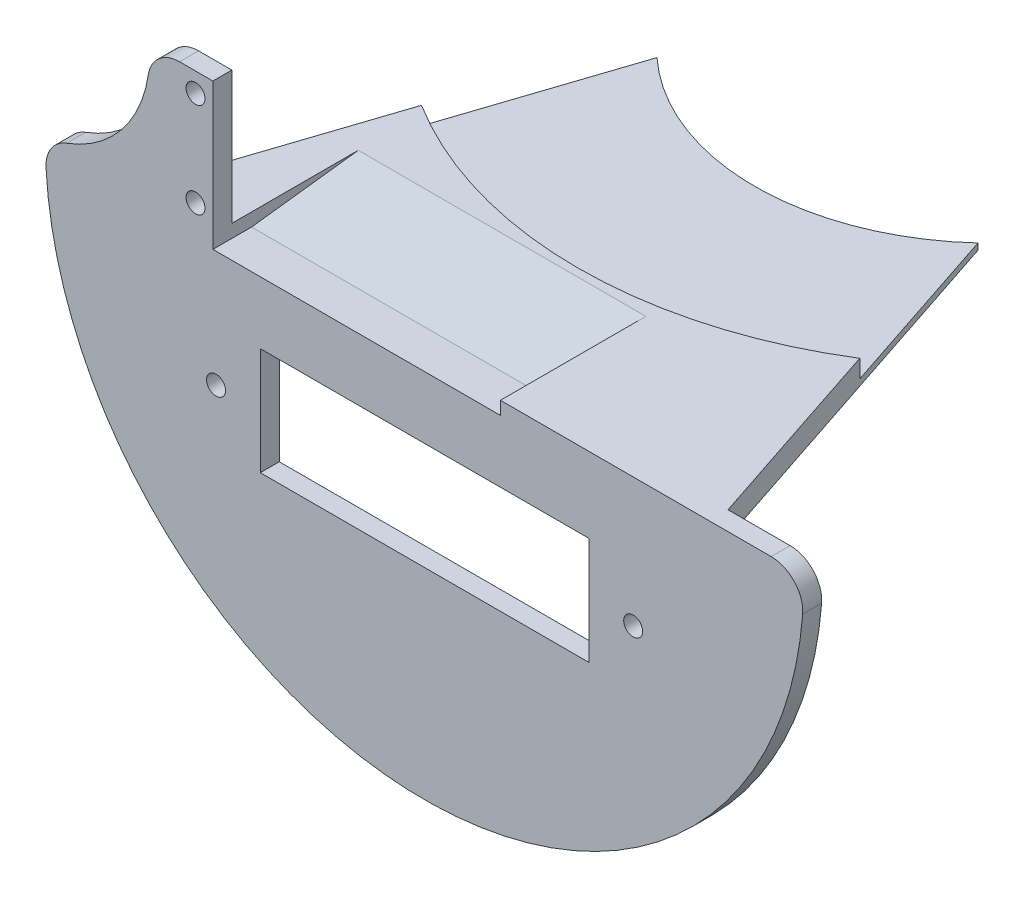
ISO-10303-21;
HEADER;
FILE_DESCRIPTION(('STEP AP214'),'2;1');
FILE_NAME('part.step','',(''),(''),'','','');
FILE_SCHEMA(('AUTOMOTIVE_DESIGN { 1 0 10303 214 1 1 1 1 }'));
ENDSEC;
DATA;
#1=APPLICATION_CONTEXT('core data for automotive mechanical design processes');
#2=APPLICATION_PROTOCOL_DEFINITION('international standard','automotive_design',2000,#1);
#3=PRODUCT_CONTEXT('',#1,'mechanical');
#4=PRODUCT('Part','Part','',(#3));
#5=PRODUCT_RELATED_PRODUCT_CATEGORY('part','',(#4));
#6=PRODUCT_DEFINITION_FORMATION('','',#4);
#7=PRODUCT_DEFINITION_CONTEXT('part definition',#1,'design');
#8=PRODUCT_DEFINITION('design','',#6,#7);
#9=PRODUCT_DEFINITION_SHAPE('','',#8);
#10=(LENGTH_UNIT() NAMED_UNIT(*) SI_UNIT(.MILLI.,.METRE.));
#11=(NAMED_UNIT(*) PLANE_ANGLE_UNIT() SI_UNIT($,.RADIAN.));
#12=(NAMED_UNIT(*) SI_UNIT($,.STERADIAN.) SOLID_ANGLE_UNIT());
#13=UNCERTAINTY_MEASURE_WITH_UNIT(LENGTH_MEASURE(1.E-05),#10,'distance_accuracy_value','');
#14=(GEOMETRIC_REPRESENTATION_CONTEXT(3) GLOBAL_UNCERTAINTY_ASSIGNED_CONTEXT((#13)) GLOBAL_UNIT_ASSIGNED_CONTEXT((#10,
#11,#12)) REPRESENTATION_CONTEXT('',''));
#15=CARTESIAN_POINT('',(0.,0.,0.));
#16=DIRECTION('',(0.,0.,1.));
#17=DIRECTION('',(1.,0.,0.));
#18=AXIS2_PLACEMENT_3D('',#15,#16,#17);
#19=CARTESIAN_POINT('',(0.,0.,0.));
#20=DIRECTION('',(0.,0.,1.));
#21=DIRECTION('',(1.,0.,0.));
#22=AXIS2_PLACEMENT_3D('',#19,#20,#21);
#23=PLANE('',#22);
#24=CARTESIAN_POINT('',(33.,15.25,0.));
#25=DIRECTION('',(0.,0.,1.));
#26=DIRECTION('',(1.,0.,0.));
#27=AXIS2_PLACEMENT_3D('',#24,#25,#26);
#28=CIRCLE('',#27,1.5);
#29=CARTESIAN_POINT('',(34.5,15.25,0.));
#30=VERTEX_POINT('',#29);
#31=EDGE_CURVE('E301',#30,#30,#28,.T.);
#32=ORIENTED_EDGE('',*,*,#31,.T.);
#33=EDGE_LOOP('',(#32));
#34=FACE_BOUND('',#33,.T.);
#35=CARTESIAN_POINT('',(-33.,15.25,0.));
#36=DIRECTION('',(0.,0.,1.));
#37=DIRECTION('',(1.,0.,0.));
#38=AXIS2_PLACEMENT_3D('',#35,#36,#37);
#39=CIRCLE('',#38,1.5);
#40=CARTESIAN_POINT('',(-31.5,15.25,0.));
#41=VERTEX_POINT('',#40);
#42=EDGE_CURVE('E304',#41,#41,#39,.T.);
#43=ORIENTED_EDGE('',*,*,#42,.T.);
#44=EDGE_LOOP('',(#43));
#45=FACE_BOUND('',#44,.T.);
#46=DIRECTION('',(0.,1.,0.));
#47=VECTOR('',#46,1.);
#48=CARTESIAN_POINT('',(26.,0.,0.));
#49=LINE('',#48,#47);
#50=CARTESIAN_POINT('',(26.,6.74999999999998,0.));
#51=VERTEX_POINT('',#50);
#52=CARTESIAN_POINT('',(26.,23.75,0.));
#53=VERTEX_POINT('',#52);
#54=EDGE_CURVE('E307',#51,#53,#49,.T.);
#55=ORIENTED_EDGE('',*,*,#54,.T.);
#56=DIRECTION('',(1.,0.,0.));
#57=VECTOR('',#56,1.);
#58=CARTESIAN_POINT('',(0.,23.75,0.));
#59=LINE('',#58,#57);
#60=CARTESIAN_POINT('',(-26.,23.75,0.));
#61=VERTEX_POINT('',#60);
#62=EDGE_CURVE('E253',#61,#53,#59,.T.);
#63=ORIENTED_EDGE('',*,*,#62,.F.);
#64=DIRECTION('',(0.,1.,0.));
#65=VECTOR('',#64,1.);
#66=CARTESIAN_POINT('',(-26.,0.,0.));
#67=LINE('',#66,#65);
#68=CARTESIAN_POINT('',(-26.,6.74999999999998,0.));
#69=VERTEX_POINT('',#68);
#70=EDGE_CURVE('E313',#69,#61,#67,.T.);
#71=ORIENTED_EDGE('',*,*,#70,.F.);
#72=DIRECTION('',(1.,0.,0.));
#73=VECTOR('',#72,1.);
#74=CARTESIAN_POINT('',(0.,6.74999999999998,0.));
#75=LINE('',#74,#73);
#76=EDGE_CURVE('E310',#69,#51,#75,.T.);
#77=ORIENTED_EDGE('',*,*,#76,.T.);
#78=EDGE_LOOP('',(#55,#63,#71,#77));
#79=FACE_BOUND('',#78,.T.);
#80=DIRECTION('',(1.,0.,0.));
#81=VECTOR('',#80,1.);
#82=CARTESIAN_POINT('',(0.,35.6726886490585,0.));
#83=LINE('',#82,#81);
#84=CARTESIAN_POINT('',(45.00900090018,35.6726886490585,0.));
#85=VERTEX_POINT('',#84);
#86=CARTESIAN_POINT('',(54.8355496006013,35.6726886490585,0.));
#87=VERTEX_POINT('',#86);
#88=EDGE_CURVE('E285',#85,#87,#83,.T.);
#89=ORIENTED_EDGE('',*,*,#88,.T.);
#90=CARTESIAN_POINT('',(54.8355496006013,30.6726886490586,0.));
#91=DIRECTION('',(0.,0.,1.));
#92=DIRECTION('',(1.,0.,0.));
#93=AXIS2_PLACEMENT_3D('',#90,#91,#92);
#94=CIRCLE('',#93,5.);
#95=CARTESIAN_POINT('',(59.8205995642923,30.2863250126949,0.));
#96=VERTEX_POINT('',#95);
#97=EDGE_CURVE('E342',#87,#96,#94,.F.);
#98=ORIENTED_EDGE('',*,*,#97,.T.);
#99=CARTESIAN_POINT('',(0.,34.9226886490585,0.));
#100=DIRECTION('',(0.,0.,1.));
#101=DIRECTION('',(1.,0.,0.));
#102=AXIS2_PLACEMENT_3D('',#99,#100,#101);
#103=CIRCLE('',#102,60.);
#104=CARTESIAN_POINT('',(-59.9083052973434,31.6068242971447,0.));
#105=VERTEX_POINT('',#104);
#106=EDGE_CURVE('E228',#96,#105,#103,.F.);
#107=ORIENTED_EDGE('',*,*,#106,.T.);
#108=CARTESIAN_POINT('',(-54.9159465225648,31.8831463264709,0.));
#109=DIRECTION('',(0.,0.,1.));
#110=DIRECTION('',(1.,0.,0.));
#111=AXIS2_PLACEMENT_3D('',#108,#109,#110);
#112=CIRCLE('',#111,5.);
#113=CARTESIAN_POINT('',(-58.1777510822093,35.6726886490585,0.));
#114=VERTEX_POINT('',#113);
#115=EDGE_CURVE('E340',#105,#114,#112,.F.);
#116=ORIENTED_EDGE('',*,*,#115,.T.);
#117=DIRECTION('',(-1.,0.,0.));
#118=VECTOR('',#117,1.);
#119=CARTESIAN_POINT('',(0.,35.6726886490585,0.));
#120=LINE('',#119,#118);
#121=CARTESIAN_POINT('',(-44.9909990998199,35.6726886490585,0.));
#122=VERTEX_POINT('',#121);
#123=EDGE_CURVE('E292',#122,#114,#120,.T.);
#124=ORIENTED_EDGE('',*,*,#123,.F.);
#125=DIRECTION('',(0.,-1.,0.));
#126=VECTOR('',#125,1.);
#127=CARTESIAN_POINT('',(-44.99099909982,140.554033587138,0.));
#128=LINE('',#127,#126);
#129=CARTESIAN_POINT('',(-44.99099909982,31.85,0.));
#130=VERTEX_POINT('',#129);
#131=EDGE_CURVE('E244',#122,#130,#128,.T.);
#132=ORIENTED_EDGE('',*,*,#131,.T.);
#133=DIRECTION('',(1.,0.,0.));
#134=VECTOR('',#133,1.);
#135=CARTESIAN_POINT('',(45.00900090018,31.85,0.));
#136=LINE('',#135,#134);
#137=CARTESIAN_POINT('',(45.00900090018,31.85,0.));
#138=VERTEX_POINT('',#137);
#139=EDGE_CURVE('E234',#130,#138,#136,.T.);
#140=ORIENTED_EDGE('',*,*,#139,.T.);
#141=DIRECTION('',(0.,-1.,0.));
#142=VECTOR('',#141,1.);
#143=CARTESIAN_POINT('',(45.00900090018,140.554033587138,0.));
#144=LINE('',#143,#142);
#145=EDGE_CURVE('E241',#85,#138,#144,.T.);
#146=ORIENTED_EDGE('',*,*,#145,.F.);
#147=EDGE_LOOP('',(#89,#98,#107,#116,#124,#132,#140,#146));
#148=FACE_BOUND('',#147,.T.);
#149=ADVANCED_FACE('F35',(#34,#45,#79,#148),#23,.F.);
#150=CARTESIAN_POINT('',(-1.73255854107879E-12,32.85,-86.7499999999999));
#151=DIRECTION('',(0.,-1.,0.));
#152=DIRECTION('',(0.992962782365133,0.,0.11842682482315));
#153=AXIS2_PLACEMENT_3D('',#150,#151,#152);
#154=PLANE('',#153);
#155=CARTESIAN_POINT('',(0.,32.85,-86.75));
#156=DIRECTION('',(0.,-1.,0.));
#157=DIRECTION('',(0.,0.,1.));
#158=AXIS2_PLACEMENT_3D('',#155,#156,#157);
#159=CIRCLE('',#158,65.5);
#160=CARTESIAN_POINT('',(34.6742987778629,32.85,-31.180736874928));
#161=VERTEX_POINT('',#160);
#162=CARTESIAN_POINT('',(-34.6672424417973,32.85,-31.176334460631));
#163=VERTEX_POINT('',#162);
#164=EDGE_CURVE('E206',#161,#163,#159,.T.);
#165=ORIENTED_EDGE('',*,*,#164,.F.);
#166=DIRECTION('',(0.314614186503307,0.,0.949219634042018));
#167=VECTOR('',#166,1.);
#168=CARTESIAN_POINT('',(25.4,32.85,-59.1621403512357));
#169=LINE('',#168,#167);
#170=CARTESIAN_POINT('',(25.4,32.85,-59.1621403512357));
#171=VERTEX_POINT('',#170);
#172=EDGE_CURVE('E225',#171,#161,#169,.T.);
#173=ORIENTED_EDGE('',*,*,#172,.F.);
#174=CARTESIAN_POINT('',(-1.73255854107879E-12,32.85,-86.7499999999999));
#175=DIRECTION('',(0.,-1.,0.));
#176=DIRECTION('',(0.,0.,-1.));
#177=AXIS2_PLACEMENT_3D('',#174,#175,#176);
#178=CIRCLE('',#177,37.5);
#179=CARTESIAN_POINT('',(-25.4,32.85,-59.1621403512325));
#180=VERTEX_POINT('',#179);
#181=EDGE_CURVE('E224',#180,#171,#178,.F.);
#182=ORIENTED_EDGE('',*,*,#181,.F.);
#183=DIRECTION('',(0.314353912144782,0.,-0.949305861100241));
#184=VECTOR('',#183,1.);
#185=CARTESIAN_POINT('',(-25.4,32.85,-59.1621403512325));
#186=LINE('',#185,#184);
#187=EDGE_CURVE('E222',#163,#180,#186,.T.);
#188=ORIENTED_EDGE('',*,*,#187,.F.);
#189=EDGE_LOOP('',(#165,#173,#182,#188));
#190=FACE_BOUND('',#189,.T.);
#191=ADVANCED_FACE('F384',(#190),#154,.F.);
#192=CARTESIAN_POINT('',(26.,0.,3.));
#193=DIRECTION('',(-1.,0.,0.));
#194=DIRECTION('',(0.,0.,1.));
#195=AXIS2_PLACEMENT_3D('',#192,#193,#194);
#196=PLANE('',#195);
#197=ORIENTED_EDGE('',*,*,#54,.F.);
#198=DIRECTION('',(0.,0.,-1.));
#199=VECTOR('',#198,1.);
#200=CARTESIAN_POINT('',(26.,6.74999999999998,3.));
#201=LINE('',#200,#199);
#202=CARTESIAN_POINT('',(26.,6.74999999999998,3.));
#203=VERTEX_POINT('',#202);
#204=EDGE_CURVE('E325',#203,#51,#201,.T.);
#205=ORIENTED_EDGE('',*,*,#204,.F.);
#206=DIRECTION('',(0.,1.,0.));
#207=VECTOR('',#206,1.);
#208=CARTESIAN_POINT('',(26.,0.,3.));
#209=LINE('',#208,#207);
#210=CARTESIAN_POINT('',(26.,23.75,3.));
#211=VERTEX_POINT('',#210);
#212=EDGE_CURVE('E271',#203,#211,#209,.T.);
#213=ORIENTED_EDGE('',*,*,#212,.T.);
#214=DIRECTION('',(0.,0.,-1.));
#215=VECTOR('',#214,1.);
#216=CARTESIAN_POINT('',(26.,23.75,3.));
#217=LINE('',#216,#215);
#218=EDGE_CURVE('E318',#211,#53,#217,.T.);
#219=ORIENTED_EDGE('',*,*,#218,.T.);
#220=EDGE_LOOP('',(#197,#205,#213,#219));
#221=FACE_BOUND('',#220,.T.);
#222=ADVANCED_FACE('F391',(#221),#196,.T.);
#223=CARTESIAN_POINT('',(0.,6.74999999999998,3.));
#224=DIRECTION('',(0.,1.,0.));
#225=DIRECTION('',(0.,0.,1.));
#226=AXIS2_PLACEMENT_3D('',#223,#224,#225);
#227=PLANE('',#226);
#228=ORIENTED_EDGE('',*,*,#76,.F.);
#229=DIRECTION('',(0.,0.,-1.));
#230=VECTOR('',#229,1.);
#231=CARTESIAN_POINT('',(-26.,6.74999999999998,3.));
#232=LINE('',#231,#230);
#233=CARTESIAN_POINT('',(-26.,6.74999999999998,3.));
#234=VERTEX_POINT('',#233);
#235=EDGE_CURVE('E323',#234,#69,#232,.T.);
#236=ORIENTED_EDGE('',*,*,#235,.F.);
#237=DIRECTION('',(1.,0.,0.));
#238=VECTOR('',#237,1.);
#239=CARTESIAN_POINT('',(0.,6.74999999999998,3.));
#240=LINE('',#239,#238);
#241=EDGE_CURVE('E274',#234,#203,#240,.T.);
#242=ORIENTED_EDGE('',*,*,#241,.T.);
#243=ORIENTED_EDGE('',*,*,#204,.T.);
#244=EDGE_LOOP('',(#228,#236,#242,#243));
#245=FACE_BOUND('',#244,.T.);
#246=ADVANCED_FACE('F643',(#245),#227,.T.);
#247=CARTESIAN_POINT('',(-26.,0.,3.));
#248=DIRECTION('',(-1.,0.,0.));
#249=DIRECTION('',(0.,0.,1.));
#250=AXIS2_PLACEMENT_3D('',#247,#248,#249);
#251=PLANE('',#250);
#252=ORIENTED_EDGE('',*,*,#70,.T.);
#253=DIRECTION('',(0.,0.,-1.));
#254=VECTOR('',#253,1.);
#255=CARTESIAN_POINT('',(-26.,23.75,3.));
#256=LINE('',#255,#254);
#257=CARTESIAN_POINT('',(-26.,23.75,3.));
#258=VERTEX_POINT('',#257);
#259=EDGE_CURVE('E320',#258,#61,#256,.T.);
#260=ORIENTED_EDGE('',*,*,#259,.F.);
#261=DIRECTION('',(0.,1.,0.));
#262=VECTOR('',#261,1.);
#263=CARTESIAN_POINT('',(-26.,0.,3.));
#264=LINE('',#263,#262);
#265=EDGE_CURVE('E277',#234,#258,#264,.T.);
#266=ORIENTED_EDGE('',*,*,#265,.F.);
#267=ORIENTED_EDGE('',*,*,#235,.T.);
#268=EDGE_LOOP('',(#252,#260,#266,#267));
#269=FACE_BOUND('',#268,.T.);
#270=ADVANCED_FACE('F442',(#269),#251,.F.);
#271=CARTESIAN_POINT('',(0.,34.9226886490585,3.));
#272=DIRECTION('',(0.,0.,-1.));
#273=DIRECTION('',(-1.,0.,0.));
#274=AXIS2_PLACEMENT_3D('',#271,#272,#273);
#275=CYLINDRICAL_SURFACE('',#274,60.);
#276=ORIENTED_EDGE('',*,*,#106,.F.);
#277=DIRECTION('',(0.,0.,-1.));
#278=VECTOR('',#277,1.);
#279=CARTESIAN_POINT('',(59.8205995642923,30.2863250126949,3.));
#280=LINE('',#279,#278);
#281=CARTESIAN_POINT('',(59.8205995642923,30.2863250126949,3.));
#282=VERTEX_POINT('',#281);
#283=EDGE_CURVE('E347',#96,#282,#280,.F.);
#284=ORIENTED_EDGE('',*,*,#283,.T.);
#285=CARTESIAN_POINT('',(0.,34.9226886490585,3.));
#286=DIRECTION('',(0.,0.,1.));
#287=DIRECTION('',(1.,0.,0.));
#288=AXIS2_PLACEMENT_3D('',#285,#286,#287);
#289=CIRCLE('',#288,60.);
#290=CARTESIAN_POINT('',(-59.9083052973434,31.6068242971447,3.));
#291=VERTEX_POINT('',#290);
#292=EDGE_CURVE('E250',#282,#291,#289,.F.);
#293=ORIENTED_EDGE('',*,*,#292,.T.);
#294=DIRECTION('',(0.,0.,-1.));
#295=VECTOR('',#294,1.);
#296=CARTESIAN_POINT('',(-59.9083052973434,31.6068242971447,3.));
#297=LINE('',#296,#295);
#298=EDGE_CURVE('E344',#291,#105,#297,.T.);
#299=ORIENTED_EDGE('',*,*,#298,.T.);
#300=EDGE_LOOP('',(#276,#284,#293,#299));
#301=FACE_BOUND('',#300,.T.);
#302=ADVANCED_FACE('F439',(#301),#275,.T.);
#303=CARTESIAN_POINT('',(-33.5,0.,3.));
#304=DIRECTION('',(-1.,0.,0.));
#305=DIRECTION('',(0.,0.,1.));
#306=AXIS2_PLACEMENT_3D('',#303,#304,#305);
#307=PLANE('',#306);
#308=DIRECTION('',(0.,1.,0.));
#309=VECTOR('',#308,1.);
#310=CARTESIAN_POINT('',(-33.5,0.,0.));
#311=LINE('',#310,#309);
#312=CARTESIAN_POINT('',(-33.5,35.6726886490585,0.));
#313=VERTEX_POINT('',#312);
#314=CARTESIAN_POINT('',(-33.5,56.6726886490585,0.));
#315=VERTEX_POINT('',#314);
#316=EDGE_CURVE('E288',#313,#315,#311,.T.);
#317=ORIENTED_EDGE('',*,*,#316,.T.);
#318=DIRECTION('',(0.,0.,-1.));
#319=VECTOR('',#318,1.);
#320=CARTESIAN_POINT('',(-33.5,56.6726886490585,3.));
#321=LINE('',#320,#319);
#322=CARTESIAN_POINT('',(-33.5,56.6726886490585,3.));
#323=VERTEX_POINT('',#322);
#324=EDGE_CURVE('E282',#323,#315,#321,.T.);
#325=ORIENTED_EDGE('',*,*,#324,.F.);
#326=DIRECTION('',(0.,1.,0.));
#327=VECTOR('',#326,1.);
#328=CARTESIAN_POINT('',(-33.5,0.,3.));
#329=LINE('',#328,#327);
#330=CARTESIAN_POINT('',(-33.5,33.6,3.));
#331=VERTEX_POINT('',#330);
#332=EDGE_CURVE('E255',#331,#323,#329,.T.);
#333=ORIENTED_EDGE('',*,*,#332,.F.);
#334=DIRECTION('',(0.,0.,1.));
#335=VECTOR('',#334,1.);
#336=CARTESIAN_POINT('',(-33.5,33.6,0.));
#337=LINE('',#336,#335);
#338=CARTESIAN_POINT('',(-33.5,33.6,-3.11930560473795));
#339=VERTEX_POINT('',#338);
#340=EDGE_CURVE('E187',#339,#331,#337,.T.);
#341=ORIENTED_EDGE('',*,*,#340,.F.);
#342=DIRECTION('',(0.,0.121869343405155,-0.992546151641321));
#343=VECTOR('',#342,1.);
#344=CARTESIAN_POINT('',(-33.5,32.3607711956107,6.97340308173268));
#345=LINE('',#344,#343);
#346=CARTESIAN_POINT('',(-33.5,35.6726886490585,-20.));
#347=VERTEX_POINT('',#346);
#348=EDGE_CURVE('E43',#339,#347,#345,.T.);
#349=ORIENTED_EDGE('',*,*,#348,.T.);
#350=DIRECTION('',(0.,0.,-1.));
#351=VECTOR('',#350,1.);
#352=CARTESIAN_POINT('',(-33.5,35.6726886490585,3.));
#353=LINE('',#352,#351);
#354=EDGE_CURVE('E57',#313,#347,#353,.T.);
#355=ORIENTED_EDGE('',*,*,#354,.F.);
#356=EDGE_LOOP('',(#317,#325,#333,#341,#349,#355));
#357=FACE_BOUND('',#356,.T.);
#358=ADVANCED_FACE('F372',(#357),#307,.F.);
#359=CARTESIAN_POINT('',(0.,56.6726886490585,3.));
#360=DIRECTION('',(0.,1.,0.));
#361=DIRECTION('',(-1.,0.,0.));
#362=AXIS2_PLACEMENT_3D('',#359,#360,#361);
#363=PLANE('',#362);
#364=DIRECTION('',(1.,0.,0.));
#365=VECTOR('',#364,1.);
#366=CARTESIAN_POINT('',(0.,56.6726886490585,0.));
#367=LINE('',#366,#365);
#368=CARTESIAN_POINT('',(-38.7739013949296,56.6726886490585,0.));
#369=VERTEX_POINT('',#368);
#370=EDGE_CURVE('E290',#369,#315,#367,.T.);
#371=ORIENTED_EDGE('',*,*,#370,.F.);
#372=DIRECTION('',(0.,0.,1.));
#373=VECTOR('',#372,1.);
#374=CARTESIAN_POINT('',(-38.7739013949296,56.6726886490585,3.));
#375=LINE('',#374,#373);
#376=CARTESIAN_POINT('',(-38.7739013949296,56.6726886490585,3.));
#377=VERTEX_POINT('',#376);
#378=EDGE_CURVE('E364',#369,#377,#375,.T.);
#379=ORIENTED_EDGE('',*,*,#378,.T.);
#380=DIRECTION('',(1.,0.,0.));
#381=VECTOR('',#380,1.);
#382=CARTESIAN_POINT('',(0.,56.6726886490585,3.));
#383=LINE('',#382,#381);
#384=EDGE_CURVE('E257',#377,#323,#383,.T.);
#385=ORIENTED_EDGE('',*,*,#384,.T.);
#386=ORIENTED_EDGE('',*,*,#324,.T.);
#387=EDGE_LOOP('',(#371,#379,#385,#386));
#388=FACE_BOUND('',#387,.T.);
#389=ADVANCED_FACE('F433',(#388),#363,.T.);
#390=CARTESIAN_POINT('',(-33.,15.25,3.));
#391=DIRECTION('',(0.,0.,-1.));
#392=DIRECTION('',(-1.,0.,0.));
#393=AXIS2_PLACEMENT_3D('',#390,#391,#392);
#394=CYLINDRICAL_SURFACE('',#393,1.5);
#395=CARTESIAN_POINT('',(-33.,15.25,3.));
#396=DIRECTION('',(0.,0.,1.));
#397=DIRECTION('',(1.,0.,0.));
#398=AXIS2_PLACEMENT_3D('',#395,#396,#397);
#399=CIRCLE('',#398,1.5);
#400=CARTESIAN_POINT('',(-31.5,15.25,3.));
#401=VERTEX_POINT('',#400);
#402=EDGE_CURVE('E268',#401,#401,#399,.T.);
#403=ORIENTED_EDGE('',*,*,#402,.T.);
#404=EDGE_LOOP('',(#403));
#405=FACE_BOUND('',#404,.T.);
#406=ORIENTED_EDGE('',*,*,#42,.F.);
#407=EDGE_LOOP('',(#406));
#408=FACE_BOUND('',#407,.T.);
#409=ADVANCED_FACE('F426',(#405,#408),#394,.F.);
#410=CARTESIAN_POINT('',(33.,15.25,3.));
#411=DIRECTION('',(0.,0.,-1.));
#412=DIRECTION('',(-1.,0.,0.));
#413=AXIS2_PLACEMENT_3D('',#410,#411,#412);
#414=CYLINDRICAL_SURFACE('',#413,1.5);
#415=CARTESIAN_POINT('',(33.,15.25,3.));
#416=DIRECTION('',(0.,0.,1.));
#417=DIRECTION('',(1.,0.,0.));
#418=AXIS2_PLACEMENT_3D('',#415,#416,#417);
#419=CIRCLE('',#418,1.5);
#420=CARTESIAN_POINT('',(34.5,15.25,3.));
#421=VERTEX_POINT('',#420);
#422=EDGE_CURVE('E265',#421,#421,#419,.T.);
#423=ORIENTED_EDGE('',*,*,#422,.T.);
#424=EDGE_LOOP('',(#423));
#425=FACE_BOUND('',#424,.T.);
#426=ORIENTED_EDGE('',*,*,#31,.F.);
#427=EDGE_LOOP('',(#426));
#428=FACE_BOUND('',#427,.T.);
#429=ADVANCED_FACE('F417',(#425,#428),#414,.F.);
#430=CARTESIAN_POINT('',(-36.25,53.6,3.));
#431=DIRECTION('',(0.,0.,-1.));
#432=DIRECTION('',(-1.,0.,0.));
#433=AXIS2_PLACEMENT_3D('',#430,#431,#432);
#434=CYLINDRICAL_SURFACE('',#433,1.5);
#435=CARTESIAN_POINT('',(-36.25,53.6,3.));
#436=DIRECTION('',(0.,0.,1.));
#437=DIRECTION('',(1.,0.,0.));
#438=AXIS2_PLACEMENT_3D('',#435,#436,#437);
#439=CIRCLE('',#438,1.5);
#440=CARTESIAN_POINT('',(-34.75,53.6,3.));
#441=VERTEX_POINT('',#440);
#442=EDGE_CURVE('E262',#441,#441,#439,.T.);
#443=ORIENTED_EDGE('',*,*,#442,.T.);
#444=EDGE_LOOP('',(#443));
#445=FACE_BOUND('',#444,.T.);
#446=CARTESIAN_POINT('',(-36.25,53.6,0.));
#447=DIRECTION('',(0.,0.,1.));
#448=DIRECTION('',(1.,0.,0.));
#449=AXIS2_PLACEMENT_3D('',#446,#447,#448);
#450=CIRCLE('',#449,1.5);
#451=CARTESIAN_POINT('',(-34.75,53.6,0.));
#452=VERTEX_POINT('',#451);
#453=EDGE_CURVE('E298',#452,#452,#450,.T.);
#454=ORIENTED_EDGE('',*,*,#453,.F.);
#455=EDGE_LOOP('',(#454));
#456=FACE_BOUND('',#455,.T.);
#457=ADVANCED_FACE('F414',(#445,#456),#434,.F.);
#458=CARTESIAN_POINT('',(-36.25,38.6,3.));
#459=DIRECTION('',(0.,0.,-1.));
#460=DIRECTION('',(-1.,0.,0.));
#461=AXIS2_PLACEMENT_3D('',#458,#459,#460);
#462=CYLINDRICAL_SURFACE('',#461,1.5);
#463=CARTESIAN_POINT('',(-36.25,38.6,3.));
#464=DIRECTION('',(0.,0.,1.));
#465=DIRECTION('',(1.,0.,0.));
#466=AXIS2_PLACEMENT_3D('',#463,#464,#465);
#467=CIRCLE('',#466,1.5);
#468=CARTESIAN_POINT('',(-34.75,38.6,3.));
#469=VERTEX_POINT('',#468);
#470=EDGE_CURVE('E259',#469,#469,#467,.T.);
#471=ORIENTED_EDGE('',*,*,#470,.T.);
#472=EDGE_LOOP('',(#471));
#473=FACE_BOUND('',#472,.T.);
#474=CARTESIAN_POINT('',(-36.25,38.6,0.));
#475=DIRECTION('',(0.,0.,1.));
#476=DIRECTION('',(1.,0.,0.));
#477=AXIS2_PLACEMENT_3D('',#474,#475,#476);
#478=CIRCLE('',#477,1.5);
#479=CARTESIAN_POINT('',(-34.75,38.6,0.));
#480=VERTEX_POINT('',#479);
#481=EDGE_CURVE('E295',#480,#480,#478,.T.);
#482=ORIENTED_EDGE('',*,*,#481,.F.);
#483=EDGE_LOOP('',(#482));
#484=FACE_BOUND('',#483,.T.);
#485=ADVANCED_FACE('F416',(#473,#484),#462,.F.);
#486=CARTESIAN_POINT('',(0.,35.6726886490585,3.));
#487=DIRECTION('',(0.,-1.,0.));
#488=DIRECTION('',(1.,0.,0.));
#489=AXIS2_PLACEMENT_3D('',#486,#487,#488);
#490=PLANE('',#489);
#491=DIRECTION('',(-1.,0.,0.));
#492=VECTOR('',#491,1.);
#493=CARTESIAN_POINT('',(0.,35.6726886490585,0.));
#494=LINE('',#493,#492);
#495=EDGE_CURVE('E327',#313,#122,#494,.T.);
#496=ORIENTED_EDGE('',*,*,#495,.F.);
#497=ORIENTED_EDGE('',*,*,#354,.T.);
#498=DIRECTION('',(1.,0.,0.));
#499=VECTOR('',#498,1.);
#500=CARTESIAN_POINT('',(12.,35.6726886490585,-20.));
#501=LINE('',#500,#499);
#502=CARTESIAN_POINT('',(12.,35.6726886490585,-20.));
#503=VERTEX_POINT('',#502);
#504=EDGE_CURVE('E366',#347,#503,#501,.T.);
#505=ORIENTED_EDGE('',*,*,#504,.T.);
#506=DIRECTION('',(0.,0.,1.));
#507=VECTOR('',#506,1.);
#508=CARTESIAN_POINT('',(12.,35.6726886490585,0.));
#509=LINE('',#508,#507);
#510=CARTESIAN_POINT('',(12.,35.6726886490585,3.));
#511=VERTEX_POINT('',#510);
#512=EDGE_CURVE('E186',#503,#511,#509,.T.);
#513=ORIENTED_EDGE('',*,*,#512,.T.);
#514=DIRECTION('',(1.,0.,0.));
#515=VECTOR('',#514,1.);
#516=CARTESIAN_POINT('',(0.,35.6726886490585,3.));
#517=LINE('',#516,#515);
#518=CARTESIAN_POINT('',(54.8355496006013,35.6726886490585,3.));
#519=VERTEX_POINT('',#518);
#520=EDGE_CURVE('E200',#511,#519,#517,.T.);
#521=ORIENTED_EDGE('',*,*,#520,.T.);
#522=DIRECTION('',(0.,0.,1.));
#523=VECTOR('',#522,1.);
#524=CARTESIAN_POINT('',(54.8355496006013,35.6726886490586,0.));
#525=LINE('',#524,#523);
#526=EDGE_CURVE('E337',#519,#87,#525,.F.);
#527=ORIENTED_EDGE('',*,*,#526,.T.);
#528=ORIENTED_EDGE('',*,*,#88,.F.);
#529=DIRECTION('',(-0.314614186503308,0.,-0.949219634042018));
#530=VECTOR('',#529,1.);
#531=CARTESIAN_POINT('',(45.00900090018,35.6726886490585,0.));
#532=LINE('',#531,#530);
#533=CARTESIAN_POINT('',(34.6742987778629,35.6726886490585,-31.180736874928));
#534=VERTEX_POINT('',#533);
#535=EDGE_CURVE('E217',#85,#534,#532,.T.);
#536=ORIENTED_EDGE('',*,*,#535,.T.);
#537=CARTESIAN_POINT('',(0.,35.6726886490585,-86.75));
#538=DIRECTION('',(0.,1.,0.));
#539=DIRECTION('',(0.,0.,1.));
#540=AXIS2_PLACEMENT_3D('',#537,#538,#539);
#541=CIRCLE('',#540,65.5);
#542=CARTESIAN_POINT('',(-34.6672424417973,35.6726886490585,-31.176334460631));
#543=VERTEX_POINT('',#542);
#544=EDGE_CURVE('E214',#534,#543,#541,.F.);
#545=ORIENTED_EDGE('',*,*,#544,.T.);
#546=DIRECTION('',(-0.314353912144782,0.,0.949305861100241));
#547=VECTOR('',#546,1.);
#548=CARTESIAN_POINT('',(-34.6672424417973,35.6726886490585,-31.176334460631));
#549=LINE('',#548,#547);
#550=EDGE_CURVE('E210',#543,#122,#549,.T.);
#551=ORIENTED_EDGE('',*,*,#550,.T.);
#552=EDGE_LOOP('',(#496,#497,#505,#513,#521,#527,#528,#536,#545,#551));
#553=FACE_BOUND('',#552,.T.);
#554=ADVANCED_FACE('F376',(#553),#490,.F.);
#555=CARTESIAN_POINT('',(0.,23.75,3.));
#556=DIRECTION('',(0.,1.,0.));
#557=DIRECTION('',(0.,0.,1.));
#558=AXIS2_PLACEMENT_3D('',#555,#556,#557);
#559=PLANE('',#558);
#560=ORIENTED_EDGE('',*,*,#62,.T.);
#561=ORIENTED_EDGE('',*,*,#218,.F.);
#562=DIRECTION('',(1.,0.,0.));
#563=VECTOR('',#562,1.);
#564=CARTESIAN_POINT('',(0.,23.75,3.));
#565=LINE('',#564,#563);
#566=EDGE_CURVE('E280',#258,#211,#565,.T.);
#567=ORIENTED_EDGE('',*,*,#566,.F.);
#568=ORIENTED_EDGE('',*,*,#259,.T.);
#569=EDGE_LOOP('',(#560,#561,#567,#568));
#570=FACE_BOUND('',#569,.T.);
#571=ADVANCED_FACE('F407',(#570),#559,.F.);
#572=CARTESIAN_POINT('',(0.,0.,3.));
#573=DIRECTION('',(0.,0.,1.));
#574=DIRECTION('',(1.,0.,0.));
#575=AXIS2_PLACEMENT_3D('',#572,#573,#574);
#576=PLANE('',#575);
#577=DIRECTION('',(1.,0.,0.));
#578=VECTOR('',#577,1.);
#579=CARTESIAN_POINT('',(-33.5,33.6,3.));
#580=LINE('',#579,#578);
#581=CARTESIAN_POINT('',(12.,33.6,3.));
#582=VERTEX_POINT('',#581);
#583=EDGE_CURVE('E191',#331,#582,#580,.T.);
#584=ORIENTED_EDGE('',*,*,#583,.F.);
#585=ORIENTED_EDGE('',*,*,#332,.T.);
#586=ORIENTED_EDGE('',*,*,#384,.F.);
#587=CARTESIAN_POINT('',(-38.7739013949296,51.6726886490585,3.));
#588=DIRECTION('',(0.,0.,1.));
#589=DIRECTION('',(1.,0.,0.));
#590=AXIS2_PLACEMENT_3D('',#587,#588,#589);
#591=CIRCLE('',#590,5.);
#592=CARTESIAN_POINT('',(-43.7191211159437,52.4107956270051,3.));
#593=VERTEX_POINT('',#592);
#594=EDGE_CURVE('E351',#377,#593,#591,.T.);
#595=ORIENTED_EDGE('',*,*,#594,.T.);
#596=CARTESIAN_POINT('',(-63.5,55.3632235387914,3.));
#597=DIRECTION('',(0.,0.,1.));
#598=DIRECTION('',(1.,0.,0.));
#599=AXIS2_PLACEMENT_3D('',#596,#597,#598);
#600=CIRCLE('',#599,20.);
#601=CARTESIAN_POINT('',(-56.6327572180519,36.579161768935,3.));
#602=VERTEX_POINT('',#601);
#603=EDGE_CURVE('E334',#593,#602,#600,.F.);
#604=ORIENTED_EDGE('',*,*,#603,.T.);
#605=CARTESIAN_POINT('',(-54.9159465225648,31.8831463264709,3.));
#606=DIRECTION('',(0.,0.,1.));
#607=DIRECTION('',(1.,0.,0.));
#608=AXIS2_PLACEMENT_3D('',#605,#606,#607);
#609=CIRCLE('',#608,5.);
#610=EDGE_CURVE('E349',#602,#291,#609,.T.);
#611=ORIENTED_EDGE('',*,*,#610,.T.);
#612=ORIENTED_EDGE('',*,*,#292,.F.);
#613=CARTESIAN_POINT('',(54.8355496006013,30.6726886490586,3.));
#614=DIRECTION('',(0.,0.,1.));
#615=DIRECTION('',(1.,0.,0.));
#616=AXIS2_PLACEMENT_3D('',#613,#614,#615);
#617=CIRCLE('',#616,5.);
#618=EDGE_CURVE('E353',#282,#519,#617,.T.);
#619=ORIENTED_EDGE('',*,*,#618,.T.);
#620=ORIENTED_EDGE('',*,*,#520,.F.);
#621=DIRECTION('',(0.,1.,0.));
#622=VECTOR('',#621,1.);
#623=CARTESIAN_POINT('',(12.,35.6726886490585,3.));
#624=LINE('',#623,#622);
#625=EDGE_CURVE('E182',#582,#511,#624,.T.);
#626=ORIENTED_EDGE('',*,*,#625,.F.);
#627=EDGE_LOOP('',(#584,#585,#586,#595,#604,#611,#612,#619,#620,#626));
#628=FACE_BOUND('',#627,.T.);
#629=ORIENTED_EDGE('',*,*,#470,.F.);
#630=EDGE_LOOP('',(#629));
#631=FACE_BOUND('',#630,.T.);
#632=ORIENTED_EDGE('',*,*,#442,.F.);
#633=EDGE_LOOP('',(#632));
#634=FACE_BOUND('',#633,.T.);
#635=ORIENTED_EDGE('',*,*,#212,.F.);
#636=ORIENTED_EDGE('',*,*,#241,.F.);
#637=ORIENTED_EDGE('',*,*,#265,.T.);
#638=ORIENTED_EDGE('',*,*,#566,.T.);
#639=EDGE_LOOP('',(#635,#636,#637,#638));
#640=FACE_BOUND('',#639,.T.);
#641=ORIENTED_EDGE('',*,*,#402,.F.);
#642=EDGE_LOOP('',(#641));
#643=FACE_BOUND('',#642,.T.);
#644=ORIENTED_EDGE('',*,*,#422,.F.);
#645=EDGE_LOOP('',(#644));
#646=FACE_BOUND('',#645,.T.);
#647=ADVANCED_FACE('F197',(#628,#631,#634,#640,#643,#646),#576,.T.);
#648=CARTESIAN_POINT('',(-63.5,55.3632235387914,0.));
#649=DIRECTION('',(0.,0.,1.));
#650=DIRECTION('',(1.,0.,0.));
#651=AXIS2_PLACEMENT_3D('',#648,#649,#650);
#652=CIRCLE('',#651,20.);
#653=CARTESIAN_POINT('',(-56.6327572180519,36.579161768935,0.));
#654=VERTEX_POINT('',#653);
#655=CARTESIAN_POINT('',(-43.7191211159437,52.4107956270051,0.));
#656=VERTEX_POINT('',#655);
#657=EDGE_CURVE('E331',#654,#656,#652,.T.);
#658=ORIENTED_EDGE('',*,*,#657,.T.);
#659=CARTESIAN_POINT('',(-38.7739013949296,51.6726886490585,0.));
#660=DIRECTION('',(0.,0.,1.));
#661=DIRECTION('',(1.,0.,0.));
#662=AXIS2_PLACEMENT_3D('',#659,#660,#661);
#663=CIRCLE('',#662,5.);
#664=EDGE_CURVE('E362',#656,#369,#663,.F.);
#665=ORIENTED_EDGE('',*,*,#664,.T.);
#666=ORIENTED_EDGE('',*,*,#370,.T.);
#667=ORIENTED_EDGE('',*,*,#316,.F.);
#668=ORIENTED_EDGE('',*,*,#495,.T.);
#669=ORIENTED_EDGE('',*,*,#123,.T.);
#670=CARTESIAN_POINT('',(-54.9159465225648,31.8831463264709,0.));
#671=DIRECTION('',(0.,0.,1.));
#672=DIRECTION('',(1.,0.,0.));
#673=AXIS2_PLACEMENT_3D('',#670,#671,#672);
#674=CIRCLE('',#673,5.);
#675=EDGE_CURVE('E360',#114,#654,#674,.F.);
#676=ORIENTED_EDGE('',*,*,#675,.T.);
#677=EDGE_LOOP('',(#658,#665,#666,#667,#668,#669,#676));
#678=FACE_BOUND('',#677,.T.);
#679=ORIENTED_EDGE('',*,*,#481,.T.);
#680=EDGE_LOOP('',(#679));
#681=FACE_BOUND('',#680,.T.);
#682=ORIENTED_EDGE('',*,*,#453,.T.);
#683=EDGE_LOOP('',(#682));
#684=FACE_BOUND('',#683,.T.);
#685=ADVANCED_FACE('F387',(#678,#681,#684),#23,.F.);
#686=CARTESIAN_POINT('',(-1.73256547997269E-12,31.85,-86.7499999999999));
#687=DIRECTION('',(0.,-1.,0.));
#688=DIRECTION('',(1.,0.,0.));
#689=AXIS2_PLACEMENT_3D('',#686,#687,#688);
#690=PLANE('',#689);
#691=CARTESIAN_POINT('',(-1.73256547997269E-12,31.85,-86.7499999999999));
#692=DIRECTION('',(0.,-1.,0.));
#693=DIRECTION('',(1.,0.,0.));
#694=AXIS2_PLACEMENT_3D('',#691,#692,#693);
#695=CIRCLE('',#694,37.5);
#696=CARTESIAN_POINT('',(25.4,31.85,-59.1621403512357));
#697=VERTEX_POINT('',#696);
#698=CARTESIAN_POINT('',(-25.4,31.85,-59.1621403512325));
#699=VERTEX_POINT('',#698);
#700=EDGE_CURVE('E213',#697,#699,#695,.T.);
#701=ORIENTED_EDGE('',*,*,#700,.F.);
#702=DIRECTION('',(-0.314614186503307,0.,-0.949219634042018));
#703=VECTOR('',#702,1.);
#704=CARTESIAN_POINT('',(25.4,31.85,-59.1621403512357));
#705=LINE('',#704,#703);
#706=EDGE_CURVE('E236',#138,#697,#705,.T.);
#707=ORIENTED_EDGE('',*,*,#706,.F.);
#708=ORIENTED_EDGE('',*,*,#139,.F.);
#709=DIRECTION('',(-0.314353912144782,0.,0.949305861100241));
#710=VECTOR('',#709,1.);
#711=CARTESIAN_POINT('',(-25.4,31.85,-59.1621403512325));
#712=LINE('',#711,#710);
#713=EDGE_CURVE('E231',#699,#130,#712,.T.);
#714=ORIENTED_EDGE('',*,*,#713,.F.);
#715=EDGE_LOOP('',(#701,#707,#708,#714));
#716=FACE_BOUND('',#715,.T.);
#717=ADVANCED_FACE('F398',(#716),#690,.T.);
#718=CARTESIAN_POINT('',(25.4,140.554033587138,-59.1621403512357));
#719=DIRECTION('',(-0.949219634042018,0.,0.314614186503307));
#720=DIRECTION('',(0.314614186503307,0.,0.949219634042018));
#721=AXIS2_PLACEMENT_3D('',#718,#719,#720);
#722=PLANE('',#721);
#723=DIRECTION('',(0.,-1.,0.));
#724=VECTOR('',#723,1.);
#725=CARTESIAN_POINT('',(25.4,140.554033587138,-59.1621403512357));
#726=LINE('',#725,#724);
#727=EDGE_CURVE('E239',#171,#697,#726,.T.);
#728=ORIENTED_EDGE('',*,*,#727,.F.);
#729=ORIENTED_EDGE('',*,*,#172,.T.);
#730=DIRECTION('',(0.,-1.,0.));
#731=VECTOR('',#730,1.);
#732=CARTESIAN_POINT('',(34.6742987778629,131.944817395197,-31.180736874928));
#733=LINE('',#732,#731);
#734=EDGE_CURVE('E204',#534,#161,#733,.T.);
#735=ORIENTED_EDGE('',*,*,#734,.F.);
#736=ORIENTED_EDGE('',*,*,#535,.F.);
#737=ORIENTED_EDGE('',*,*,#145,.T.);
#738=ORIENTED_EDGE('',*,*,#706,.T.);
#739=EDGE_LOOP('',(#728,#729,#735,#736,#737,#738));
#740=FACE_BOUND('',#739,.T.);
#741=ADVANCED_FACE('F404',(#740),#722,.F.);
#742=CARTESIAN_POINT('',(-25.4,140.554033587138,-59.1621403512325));
#743=DIRECTION('',(0.949305861100241,0.,0.314353912144782));
#744=DIRECTION('',(0.314353912144782,0.,-0.949305861100241));
#745=AXIS2_PLACEMENT_3D('',#742,#743,#744);
#746=PLANE('',#745);
#747=ORIENTED_EDGE('',*,*,#131,.F.);
#748=ORIENTED_EDGE('',*,*,#550,.F.);
#749=DIRECTION('',(0.,-1.,0.));
#750=VECTOR('',#749,1.);
#751=CARTESIAN_POINT('',(-34.6672424417973,131.944817395197,-31.176334460631));
#752=LINE('',#751,#750);
#753=EDGE_CURVE('E209',#543,#163,#752,.T.);
#754=ORIENTED_EDGE('',*,*,#753,.T.);
#755=ORIENTED_EDGE('',*,*,#187,.T.);
#756=DIRECTION('',(0.,-1.,0.));
#757=VECTOR('',#756,1.);
#758=CARTESIAN_POINT('',(-25.4,140.554033587138,-59.1621403512325));
#759=LINE('',#758,#757);
#760=EDGE_CURVE('E246',#180,#699,#759,.T.);
#761=ORIENTED_EDGE('',*,*,#760,.T.);
#762=ORIENTED_EDGE('',*,*,#713,.T.);
#763=EDGE_LOOP('',(#747,#748,#754,#755,#761,#762));
#764=FACE_BOUND('',#763,.T.);
#765=ADVANCED_FACE('F488',(#764),#746,.F.);
#766=CARTESIAN_POINT('',(-1.7318111942167E-12,140.554033587138,-86.7499999999999));
#767=DIRECTION('',(0.,-1.,0.));
#768=DIRECTION('',(1.,0.,0.));
#769=AXIS2_PLACEMENT_3D('',#766,#767,#768);
#770=CYLINDRICAL_SURFACE('',#769,37.5);
#771=ORIENTED_EDGE('',*,*,#760,.F.);
#772=ORIENTED_EDGE('',*,*,#181,.T.);
#773=ORIENTED_EDGE('',*,*,#727,.T.);
#774=ORIENTED_EDGE('',*,*,#700,.T.);
#775=EDGE_LOOP('',(#771,#772,#773,#774));
#776=FACE_BOUND('',#775,.T.);
#777=ADVANCED_FACE('F500',(#776),#770,.F.);
#778=CARTESIAN_POINT('',(0.,131.944817395197,-86.75));
#779=DIRECTION('',(0.,-1.,0.));
#780=DIRECTION('',(0.,0.,-1.));
#781=AXIS2_PLACEMENT_3D('',#778,#779,#780);
#782=CYLINDRICAL_SURFACE('',#781,65.5);
#783=ORIENTED_EDGE('',*,*,#544,.F.);
#784=ORIENTED_EDGE('',*,*,#734,.T.);
#785=ORIENTED_EDGE('',*,*,#164,.T.);
#786=ORIENTED_EDGE('',*,*,#753,.F.);
#787=EDGE_LOOP('',(#783,#784,#785,#786));
#788=FACE_BOUND('',#787,.T.);
#789=ADVANCED_FACE('F448',(#788),#782,.F.);
#790=CARTESIAN_POINT('',(-63.5,55.3632235387914,3.));
#791=DIRECTION('',(0.,0.,-1.));
#792=DIRECTION('',(-1.,0.,0.));
#793=AXIS2_PLACEMENT_3D('',#790,#791,#792);
#794=CYLINDRICAL_SURFACE('',#793,20.);
#795=ORIENTED_EDGE('',*,*,#603,.F.);
#796=DIRECTION('',(0.,0.,-1.));
#797=VECTOR('',#796,1.);
#798=CARTESIAN_POINT('',(-43.7191211159437,52.4107956270051,3.));
#799=LINE('',#798,#797);
#800=EDGE_CURVE('E357',#593,#656,#799,.T.);
#801=ORIENTED_EDGE('',*,*,#800,.T.);
#802=ORIENTED_EDGE('',*,*,#657,.F.);
#803=DIRECTION('',(0.,0.,-1.));
#804=VECTOR('',#803,1.);
#805=CARTESIAN_POINT('',(-56.6327572180519,36.579161768935,3.));
#806=LINE('',#805,#804);
#807=EDGE_CURVE('E355',#654,#602,#806,.F.);
#808=ORIENTED_EDGE('',*,*,#807,.T.);
#809=EDGE_LOOP('',(#795,#801,#802,#808));
#810=FACE_BOUND('',#809,.T.);
#811=ADVANCED_FACE('F444',(#810),#794,.F.);
#812=CARTESIAN_POINT('',(54.8355496006013,30.6726886490586,3.));
#813=DIRECTION('',(0.,0.,-1.));
#814=DIRECTION('',(-1.,0.,0.));
#815=AXIS2_PLACEMENT_3D('',#812,#813,#814);
#816=CYLINDRICAL_SURFACE('',#815,5.);
#817=ORIENTED_EDGE('',*,*,#618,.F.);
#818=ORIENTED_EDGE('',*,*,#283,.F.);
#819=ORIENTED_EDGE('',*,*,#97,.F.);
#820=ORIENTED_EDGE('',*,*,#526,.F.);
#821=EDGE_LOOP('',(#817,#818,#819,#820));
#822=FACE_BOUND('',#821,.T.);
#823=ADVANCED_FACE('F447',(#822),#816,.T.);
#824=CARTESIAN_POINT('',(-38.7739013949296,51.6726886490585,3.));
#825=DIRECTION('',(0.,0.,-1.));
#826=DIRECTION('',(-1.,0.,0.));
#827=AXIS2_PLACEMENT_3D('',#824,#825,#826);
#828=CYLINDRICAL_SURFACE('',#827,5.);
#829=ORIENTED_EDGE('',*,*,#594,.F.);
#830=ORIENTED_EDGE('',*,*,#378,.F.);
#831=ORIENTED_EDGE('',*,*,#664,.F.);
#832=ORIENTED_EDGE('',*,*,#800,.F.);
#833=EDGE_LOOP('',(#829,#830,#831,#832));
#834=FACE_BOUND('',#833,.T.);
#835=ADVANCED_FACE('F452',(#834),#828,.T.);
#836=CARTESIAN_POINT('',(-54.9159465225648,31.8831463264709,3.));
#837=DIRECTION('',(0.,0.,1.));
#838=DIRECTION('',(1.,0.,0.));
#839=AXIS2_PLACEMENT_3D('',#836,#837,#838);
#840=CYLINDRICAL_SURFACE('',#839,5.);
#841=ORIENTED_EDGE('',*,*,#610,.F.);
#842=ORIENTED_EDGE('',*,*,#807,.F.);
#843=ORIENTED_EDGE('',*,*,#675,.F.);
#844=ORIENTED_EDGE('',*,*,#115,.F.);
#845=ORIENTED_EDGE('',*,*,#298,.F.);
#846=EDGE_LOOP('',(#841,#842,#843,#844,#845));
#847=FACE_BOUND('',#846,.T.);
#848=ADVANCED_FACE('F455',(#847),#840,.T.);
#849=CARTESIAN_POINT('',(12.,35.6726886490585,0.));
#850=DIRECTION('',(1.,0.,0.));
#851=DIRECTION('',(0.,0.,-1.));
#852=AXIS2_PLACEMENT_3D('',#849,#850,#851);
#853=PLANE('',#852);
#854=ORIENTED_EDGE('',*,*,#625,.T.);
#855=ORIENTED_EDGE('',*,*,#512,.F.);
#856=DIRECTION('',(0.,-0.121869343405155,0.992546151641321));
#857=VECTOR('',#856,1.);
#858=CARTESIAN_POINT('',(12.,33.2534696930617,-0.297042737240069));
#859=LINE('',#858,#857);
#860=CARTESIAN_POINT('',(12.,33.6,-3.11930560473764));
#861=VERTEX_POINT('',#860);
#862=EDGE_CURVE('E11',#503,#861,#859,.T.);
#863=ORIENTED_EDGE('',*,*,#862,.T.);
#864=DIRECTION('',(0.,0.,1.));
#865=VECTOR('',#864,1.);
#866=CARTESIAN_POINT('',(12.,33.6,0.));
#867=LINE('',#866,#865);
#868=EDGE_CURVE('E50',#861,#582,#867,.T.);
#869=ORIENTED_EDGE('',*,*,#868,.T.);
#870=EDGE_LOOP('',(#854,#855,#863,#869));
#871=FACE_BOUND('',#870,.T.);
#872=ADVANCED_FACE('F180',(#871),#853,.F.);
#873=CARTESIAN_POINT('',(-33.5,33.6,0.));
#874=DIRECTION('',(0.,-1.,0.));
#875=DIRECTION('',(0.,0.,-1.));
#876=AXIS2_PLACEMENT_3D('',#873,#874,#875);
#877=PLANE('',#876);
#878=ORIENTED_EDGE('',*,*,#583,.T.);
#879=ORIENTED_EDGE('',*,*,#868,.F.);
#880=DIRECTION('',(-1.,0.,0.));
#881=VECTOR('',#880,1.);
#882=CARTESIAN_POINT('',(-33.5,33.6,-3.11930560473795));
#883=LINE('',#882,#881);
#884=EDGE_CURVE('E370',#861,#339,#883,.T.);
#885=ORIENTED_EDGE('',*,*,#884,.T.);
#886=ORIENTED_EDGE('',*,*,#340,.T.);
#887=EDGE_LOOP('',(#878,#879,#885,#886));
#888=FACE_BOUND('',#887,.T.);
#889=ADVANCED_FACE('F192',(#888),#877,.F.);
#890=CARTESIAN_POINT('',(0.,33.2169974310003,0.));
#891=DIRECTION('',(0.,0.992546151641321,0.121869343405155));
#892=DIRECTION('',(1.,0.,0.));
#893=AXIS2_PLACEMENT_3D('',#890,#891,#892);
#894=PLANE('',#893);
#895=ORIENTED_EDGE('',*,*,#862,.F.);
#896=ORIENTED_EDGE('',*,*,#504,.F.);
#897=ORIENTED_EDGE('',*,*,#348,.F.);
#898=ORIENTED_EDGE('',*,*,#884,.F.);
#899=EDGE_LOOP('',(#895,#896,#897,#898));
#900=FACE_BOUND('',#899,.T.);
#901=ADVANCED_FACE('F37',(#900),#894,.T.);
#902=CLOSED_SHELL('',(#149,#191,#222,#246,#270,#302,#358,#389,#409,#429,#457,#485,#554,#571,
#647,#685,#717,#741,#765,#777,#789,#811,#823,#835,#848,#872,#889,#901));
#903=MANIFOLD_SOLID_BREP('B2',#902);
#904=ADVANCED_BREP_SHAPE_REPRESENTATION('',(#18,#903),#14);
#905=SHAPE_DEFINITION_REPRESENTATION(#9,#904);
ENDSEC;
END-ISO-10303-21;
